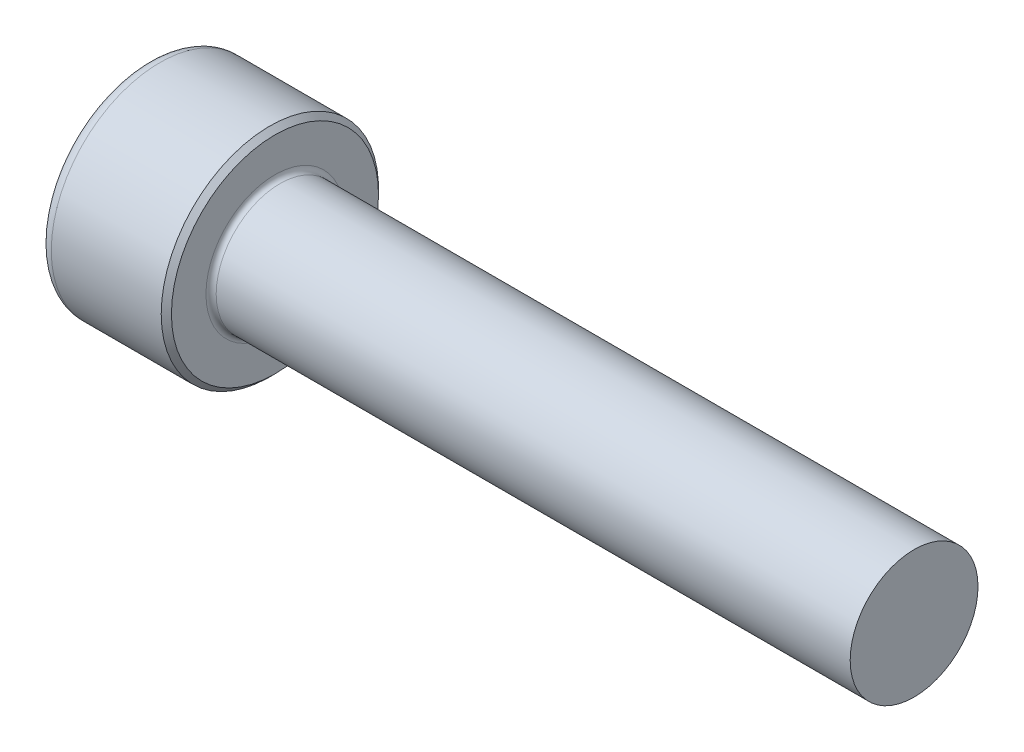
ISO-10303-21;
HEADER;
FILE_DESCRIPTION(('STEP AP214'),'2;1');
FILE_NAME('part.step','',(''),(''),'','','');
FILE_SCHEMA(('AUTOMOTIVE_DESIGN { 1 0 10303 214 1 1 1 1 }'));
ENDSEC;
DATA;
#1=APPLICATION_CONTEXT('core data for automotive mechanical design processes');
#2=APPLICATION_PROTOCOL_DEFINITION('international standard','automotive_design',2000,#1);
#3=PRODUCT_CONTEXT('',#1,'mechanical');
#4=PRODUCT('Part','Part','',(#3));
#5=PRODUCT_RELATED_PRODUCT_CATEGORY('part','',(#4));
#6=PRODUCT_DEFINITION_FORMATION('','',#4);
#7=PRODUCT_DEFINITION_CONTEXT('part definition',#1,'design');
#8=PRODUCT_DEFINITION('design','',#6,#7);
#9=PRODUCT_DEFINITION_SHAPE('','',#8);
#10=(LENGTH_UNIT() NAMED_UNIT(*) SI_UNIT(.MILLI.,.METRE.));
#11=(NAMED_UNIT(*) PLANE_ANGLE_UNIT() SI_UNIT($,.RADIAN.));
#12=(NAMED_UNIT(*) SI_UNIT($,.STERADIAN.) SOLID_ANGLE_UNIT());
#13=UNCERTAINTY_MEASURE_WITH_UNIT(LENGTH_MEASURE(1.E-05),#10,'distance_accuracy_value','');
#14=(GEOMETRIC_REPRESENTATION_CONTEXT(3) GLOBAL_UNCERTAINTY_ASSIGNED_CONTEXT((#13)) GLOBAL_UNIT_ASSIGNED_CONTEXT((#10,
#11,#12)) REPRESENTATION_CONTEXT('',''));
#15=CARTESIAN_POINT('',(0.,0.,0.));
#16=DIRECTION('',(0.,0.,1.));
#17=DIRECTION('',(1.,0.,0.));
#18=AXIS2_PLACEMENT_3D('',#15,#16,#17);
#19=CARTESIAN_POINT('',(0.,0.,0.));
#20=DIRECTION('',(-1.,0.,0.));
#21=DIRECTION('',(0.,0.,1.));
#22=AXIS2_PLACEMENT_3D('',#19,#20,#21);
#23=CYLINDRICAL_SURFACE('',#22,2.5);
#24=CARTESIAN_POINT('',(5.2,0.,0.));
#25=DIRECTION('',(-1.,0.,0.));
#26=DIRECTION('',(0.,0.,1.));
#27=AXIS2_PLACEMENT_3D('',#24,#25,#26);
#28=CIRCLE('',#27,2.5);
#29=CARTESIAN_POINT('',(5.2,0.,2.5));
#30=VERTEX_POINT('',#29);
#31=EDGE_CURVE('E202',#30,#30,#28,.T.);
#32=ORIENTED_EDGE('',*,*,#31,.F.);
#33=EDGE_LOOP('',(#32));
#34=FACE_BOUND('',#33,.T.);
#35=CARTESIAN_POINT('',(30.,0.,0.));
#36=DIRECTION('',(1.,0.,0.));
#37=DIRECTION('',(0.,0.,-1.));
#38=AXIS2_PLACEMENT_3D('',#35,#36,#37);
#39=CIRCLE('',#38,2.5);
#40=CARTESIAN_POINT('',(30.,0.,-2.5));
#41=VERTEX_POINT('',#40);
#42=EDGE_CURVE('E49',#41,#41,#39,.T.);
#43=ORIENTED_EDGE('',*,*,#42,.F.);
#44=EDGE_LOOP('',(#43));
#45=FACE_BOUND('',#44,.T.);
#46=ADVANCED_FACE('F45',(#34,#45),#23,.T.);
#47=CARTESIAN_POINT('',(0.,0.,0.));
#48=DIRECTION('',(1.,0.,0.));
#49=DIRECTION('',(0.,0.,-1.));
#50=AXIS2_PLACEMENT_3D('',#47,#48,#49);
#51=PLANE('',#50);
#52=CARTESIAN_POINT('',(0.,0.,0.));
#53=DIRECTION('',(1.,0.,0.));
#54=DIRECTION('',(0.,0.,-1.));
#55=AXIS2_PLACEMENT_3D('',#52,#53,#54);
#56=CIRCLE('',#55,3.75);
#57=CARTESIAN_POINT('',(0.,0.,-3.75));
#58=VERTEX_POINT('',#57);
#59=EDGE_CURVE('E194',#58,#58,#56,.F.);
#60=ORIENTED_EDGE('',*,*,#59,.T.);
#61=EDGE_LOOP('',(#60));
#62=FACE_BOUND('',#61,.T.);
#63=CARTESIAN_POINT('',(0.,0.,0.));
#64=DIRECTION('',(-1.,0.,0.));
#65=DIRECTION('',(0.,0.,1.));
#66=AXIS2_PLACEMENT_3D('',#63,#64,#65);
#67=CIRCLE('',#66,2.29);
#68=CARTESIAN_POINT('',(0.,0.,-2.29));
#69=VERTEX_POINT('',#68);
#70=CARTESIAN_POINT('',(0.,-1.98319817466637,-1.145));
#71=VERTEX_POINT('',#70);
#72=EDGE_CURVE('E68',#69,#71,#67,.T.);
#73=ORIENTED_EDGE('',*,*,#72,.F.);
#74=CARTESIAN_POINT('',(0.,1.98319817466637,-1.145));
#75=VERTEX_POINT('',#74);
#76=EDGE_CURVE('E147',#75,#69,#67,.T.);
#77=ORIENTED_EDGE('',*,*,#76,.F.);
#78=CARTESIAN_POINT('',(0.,1.98319817466637,1.145));
#79=VERTEX_POINT('',#78);
#80=EDGE_CURVE('E139',#79,#75,#67,.T.);
#81=ORIENTED_EDGE('',*,*,#80,.F.);
#82=CARTESIAN_POINT('',(0.,0.,2.29));
#83=VERTEX_POINT('',#82);
#84=EDGE_CURVE('E110',#83,#79,#67,.T.);
#85=ORIENTED_EDGE('',*,*,#84,.F.);
#86=CARTESIAN_POINT('',(0.,-1.98319817466637,1.145));
#87=VERTEX_POINT('',#86);
#88=EDGE_CURVE('E100',#87,#83,#67,.T.);
#89=ORIENTED_EDGE('',*,*,#88,.F.);
#90=EDGE_CURVE('E61',#71,#87,#67,.T.);
#91=ORIENTED_EDGE('',*,*,#90,.F.);
#92=EDGE_LOOP('',(#73,#77,#81,#85,#89,#91));
#93=FACE_BOUND('',#92,.T.);
#94=ADVANCED_FACE('F137',(#62,#93),#51,.F.);
#95=CARTESIAN_POINT('',(0.,0.,0.));
#96=DIRECTION('',(-1.,0.,0.));
#97=DIRECTION('',(0.,0.,1.));
#98=AXIS2_PLACEMENT_3D('',#95,#96,#97);
#99=CYLINDRICAL_SURFACE('',#98,4.25);
#100=CARTESIAN_POINT('',(4.8,0.,0.));
#101=DIRECTION('',(-1.,0.,0.));
#102=DIRECTION('',(0.,0.,1.));
#103=AXIS2_PLACEMENT_3D('',#100,#101,#102);
#104=CIRCLE('',#103,4.25);
#105=CARTESIAN_POINT('',(4.8,0.,4.25));
#106=VERTEX_POINT('',#105);
#107=EDGE_CURVE('E186',#106,#106,#104,.T.);
#108=ORIENTED_EDGE('',*,*,#107,.T.);
#109=EDGE_LOOP('',(#108));
#110=FACE_BOUND('',#109,.T.);
#111=CARTESIAN_POINT('',(0.5,0.,0.));
#112=DIRECTION('',(1.,0.,0.));
#113=DIRECTION('',(0.,0.,-1.));
#114=AXIS2_PLACEMENT_3D('',#111,#112,#113);
#115=CIRCLE('',#114,4.25);
#116=CARTESIAN_POINT('',(0.5,0.,-4.25));
#117=VERTEX_POINT('',#116);
#118=EDGE_CURVE('E190',#117,#117,#115,.T.);
#119=ORIENTED_EDGE('',*,*,#118,.T.);
#120=EDGE_LOOP('',(#119));
#121=FACE_BOUND('',#120,.T.);
#122=ADVANCED_FACE('F274',(#110,#121),#99,.T.);
#123=CARTESIAN_POINT('',(5.,4.25,0.));
#124=DIRECTION('',(-1.,0.,0.));
#125=DIRECTION('',(0.,0.,1.));
#126=AXIS2_PLACEMENT_3D('',#123,#124,#125);
#127=PLANE('',#126);
#128=CARTESIAN_POINT('',(5.,0.,0.));
#129=DIRECTION('',(-1.,0.,0.));
#130=DIRECTION('',(0.,0.,1.));
#131=AXIS2_PLACEMENT_3D('',#128,#129,#130);
#132=CIRCLE('',#131,4.05);
#133=CARTESIAN_POINT('',(5.,0.,4.05));
#134=VERTEX_POINT('',#133);
#135=EDGE_CURVE('E55',#134,#134,#132,.F.);
#136=ORIENTED_EDGE('',*,*,#135,.T.);
#137=EDGE_LOOP('',(#136));
#138=FACE_BOUND('',#137,.T.);
#139=CARTESIAN_POINT('',(5.,0.,0.));
#140=DIRECTION('',(-1.,0.,0.));
#141=DIRECTION('',(0.,0.,1.));
#142=AXIS2_PLACEMENT_3D('',#139,#140,#141);
#143=CIRCLE('',#142,2.7);
#144=CARTESIAN_POINT('',(5.,0.,2.7));
#145=VERTEX_POINT('',#144);
#146=EDGE_CURVE('E198',#145,#145,#143,.T.);
#147=ORIENTED_EDGE('',*,*,#146,.T.);
#148=EDGE_LOOP('',(#147));
#149=FACE_BOUND('',#148,.T.);
#150=ADVANCED_FACE('F284',(#138,#149),#127,.F.);
#151=CARTESIAN_POINT('',(5.2,0.,0.));
#152=DIRECTION('',(-1.,0.,0.));
#153=DIRECTION('',(0.,0.,1.));
#154=AXIS2_PLACEMENT_3D('',#151,#152,#153);
#155=TOROIDAL_SURFACE('',#154,2.7,0.2);
#156=ORIENTED_EDGE('',*,*,#146,.F.);
#157=EDGE_LOOP('',(#156));
#158=FACE_BOUND('',#157,.T.);
#159=ORIENTED_EDGE('',*,*,#31,.T.);
#160=EDGE_LOOP('',(#159));
#161=FACE_BOUND('',#160,.T.);
#162=ADVANCED_FACE('F280',(#158,#161),#155,.F.);
#163=CARTESIAN_POINT('',(0.5,0.,0.));
#164=DIRECTION('',(1.,0.,0.));
#165=DIRECTION('',(0.,0.,-1.));
#166=AXIS2_PLACEMENT_3D('',#163,#164,#165);
#167=TOROIDAL_SURFACE('',#166,3.75,0.5);
#168=ORIENTED_EDGE('',*,*,#118,.F.);
#169=EDGE_LOOP('',(#168));
#170=FACE_BOUND('',#169,.T.);
#171=ORIENTED_EDGE('',*,*,#59,.F.);
#172=EDGE_LOOP('',(#171));
#173=FACE_BOUND('',#172,.T.);
#174=ADVANCED_FACE('F283',(#170,#173),#167,.T.);
#175=CARTESIAN_POINT('',(4.8,0.,0.));
#176=DIRECTION('',(-1.,0.,0.));
#177=DIRECTION('',(0.,0.,1.));
#178=AXIS2_PLACEMENT_3D('',#175,#176,#177);
#179=CONICAL_SURFACE('',#178,4.25,0.785398163397453);
#180=ORIENTED_EDGE('',*,*,#135,.F.);
#181=EDGE_LOOP('',(#180));
#182=FACE_BOUND('',#181,.T.);
#183=ORIENTED_EDGE('',*,*,#107,.F.);
#184=EDGE_LOOP('',(#183));
#185=FACE_BOUND('',#184,.T.);
#186=ADVANCED_FACE('F47',(#182,#185),#179,.T.);
#187=CARTESIAN_POINT('',(0.,0.,0.));
#188=DIRECTION('',(-1.,0.,0.));
#189=DIRECTION('',(0.,0.,1.));
#190=AXIS2_PLACEMENT_3D('',#187,#188,#189);
#191=CONICAL_SURFACE('',#190,2.29,1.0471975511966);
#192=ORIENTED_EDGE('',*,*,#84,.T.);
#193=CARTESIAN_POINT('',(-6.66717087727477E-05,-0.000199999999999763,2.29011547005384));
#194=CARTESIAN_POINT('',(0.0289970746443421,0.086952924434542,2.23979770567089));
#195=CARTESIAN_POINT('',(0.0554298671491021,0.174858144215212,2.18904560336735));
#196=CARTESIAN_POINT('',(0.101569432018717,0.352190878966828,2.08666250122237));
#197=CARTESIAN_POINT('',(0.121259880415737,0.44162154580974,2.03502968164681));
#198=CARTESIAN_POINT('',(0.151912109098693,0.619374508700817,1.93240396067239));
#199=CARTESIAN_POINT('',(0.163077876213052,0.707669449094417,1.88142685306806));
#200=CARTESIAN_POINT('',(0.17640951895551,0.884674966706633,1.7792326698266));
#201=CARTESIAN_POINT('',(0.178586432176738,0.97338490019511,1.72801596584724));
#202=CARTESIAN_POINT('',(0.174067162231532,1.13915625525884,1.63230782937726));
#203=CARTESIAN_POINT('',(0.168480615987234,1.21624244292292,1.5878020981786));
#204=CARTESIAN_POINT('',(0.150771602252674,1.36991258205614,1.49908060198363));
#205=CARTESIAN_POINT('',(0.138643080409066,1.44649600167483,1.45486514405132));
#206=CARTESIAN_POINT('',(0.108321556973433,1.60048319626379,1.36596059580363));
#207=CARTESIAN_POINT('',(0.0899999732190711,1.67786747328963,1.32128276263171));
#208=CARTESIAN_POINT('',(0.0484167389071468,1.83148159838581,1.2325936061561));
#209=CARTESIAN_POINT('',(0.0251648643389043,1.90771341577406,1.18858114586619));
#210=CARTESIAN_POINT('',(-6.667170877254E-05,1.98339817466637,1.14488452994616));
#211=B_SPLINE_CURVE_WITH_KNOTS('',3,(#193,#194,#195,#196,#197,#198,#199,#200,#201,#202,#203,
#204,#205,#206,#207,#208,#209,#210),.UNSPECIFIED.,.F.,.F.,(4,2,2,2,2,2,2,2,4),(0.,
0.314368600877967,0.629493028947399,0.936817561586036,1.24376461187035,1.5110699369469,
1.7786230686029,2.05211240025128,2.32506443371539),.UNSPECIFIED.);
#212=EDGE_CURVE('E11',#83,#79,#211,.T.);
#213=ORIENTED_EDGE('',*,*,#212,.F.);
#214=EDGE_LOOP('',(#192,#213));
#215=FACE_BOUND('',#214,.T.);
#216=ADVANCED_FACE('F113',(#215),#191,.F.);
#217=ORIENTED_EDGE('',*,*,#80,.T.);
#218=CARTESIAN_POINT('',(-0.737423065904649,1.98319817466636,-2.9651690756887));
#219=CARTESIAN_POINT('',(-0.696335597798475,1.98319817466636,-2.87952774841077));
#220=CARTESIAN_POINT('',(-0.65567489694743,1.98319817466636,-2.79367778718436));
#221=CARTESIAN_POINT('',(-0.575449127727106,1.98319817466636,-2.62144940035753));
#222=CARTESIAN_POINT('',(-0.535884256534338,1.98319817466636,-2.53507088302234));
#223=CARTESIAN_POINT('',(-0.457871214679984,1.98319817466636,-2.36117891825076));
#224=CARTESIAN_POINT('',(-0.419431273823567,1.98319817466636,-2.27366176473997));
#225=CARTESIAN_POINT('',(-0.344275135005474,1.98319817466636,-2.09789307129859));
#226=CARTESIAN_POINT('',(-0.307558847416684,1.98319817466636,-2.00964156983442));
#227=CARTESIAN_POINT('',(-0.23537405891633,1.98319817466636,-1.82993909718885));
#228=CARTESIAN_POINT('',(-0.199963281311202,1.98319817466636,-1.73846480209699));
#229=CARTESIAN_POINT('',(-0.132085804136675,1.98319817466636,-1.55440976387771));
#230=CARTESIAN_POINT('',(-0.0996194460365617,1.98319817466636,-1.46182889382445));
#231=CARTESIAN_POINT('',(-0.0385592553831905,1.98319817466636,-1.27562724000914));
#232=CARTESIAN_POINT('',(-0.00995646709253792,1.98319817466636,-1.18200942505016));
#233=CARTESIAN_POINT('',(0.04239847198178,1.98319817466636,-0.993432151978476));
#234=CARTESIAN_POINT('',(0.0661518274561018,1.98319817466636,-0.898473033353332));
#235=CARTESIAN_POINT('',(0.107541445767531,1.98319817466636,-0.707410736519421));
#236=CARTESIAN_POINT('',(0.12519027230812,1.98319817466636,-0.611310334196718));
#237=CARTESIAN_POINT('',(0.153215985445547,1.98319817466636,-0.418035031067098));
#238=CARTESIAN_POINT('',(0.163593363460354,1.98319817466636,-0.320860203322791));
#239=CARTESIAN_POINT('',(0.176110295556352,1.98319817466636,-0.12713531096718));
#240=CARTESIAN_POINT('',(0.178347061886284,1.98319817466637,-0.0305917109258025));
#241=CARTESIAN_POINT('',(0.174654313491269,1.98319817466637,0.162335586315468));
#242=CARTESIAN_POINT('',(0.168724293109126,1.98319817466637,0.258719273244178));
#243=CARTESIAN_POINT('',(0.144538657394588,1.98319817466637,0.496531836309324));
#244=CARTESIAN_POINT('',(0.121750533293761,1.98319817466637,0.637499920804447));
#245=CARTESIAN_POINT('',(0.0629865996332653,1.98319817466637,0.916694739102691));
#246=CARTESIAN_POINT('',(0.0269948957486464,1.98319817466637,1.05491795638262));
#247=CARTESIAN_POINT('',(-0.0344877429393334,1.98319817466637,1.26164599106909));
#248=CARTESIAN_POINT('',(-0.0565178888246669,1.98319817466637,1.33121940303916));
#249=CARTESIAN_POINT('',(-0.102616094096623,1.98319817466637,1.46964201153911));
#250=CARTESIAN_POINT('',(-0.126682881667825,1.98319817466637,1.53849163028932));
#251=CARTESIAN_POINT('',(-0.176504851106972,1.98319817466637,1.67555866191056));
#252=CARTESIAN_POINT('',(-0.202259726135116,1.98319817466637,1.74377618711701));
#253=CARTESIAN_POINT('',(-0.255179289864796,1.98319817466637,1.87967370656846));
#254=CARTESIAN_POINT('',(-0.282344216759939,1.98319817466637,1.947353607754));
#255=CARTESIAN_POINT('',(-0.353423903033721,1.98319817466637,2.12010925018289));
#256=CARTESIAN_POINT('',(-0.398177319478556,1.98319817466637,2.22483955976595));
#257=CARTESIAN_POINT('',(-0.489841525450775,1.98319817466637,2.43335442741098));
#258=CARTESIAN_POINT('',(-0.536752476595294,1.98319817466637,2.53713891392301));
#259=CARTESIAN_POINT('',(-0.67996107526549,1.98319817466637,2.84738878513368));
#260=CARTESIAN_POINT('',(-0.778719786371109,1.98319817466637,3.05271592662016));
#261=CARTESIAN_POINT('',(-0.980379133367604,1.98319817466637,3.46161603190118));
#262=CARTESIAN_POINT('',(-1.08328471183425,1.98319817466637,3.66518652891241));
#263=CARTESIAN_POINT('',(-1.29174190336883,1.98319817466637,4.07093277316329));
#264=CARTESIAN_POINT('',(-1.39729318010141,1.98319817466637,4.27310869356374));
#265=CARTESIAN_POINT('',(-1.60016980433773,1.98319817466637,4.65745813317928));
#266=CARTESIAN_POINT('',(-1.69733123970717,1.98319817466637,4.83971847371059));
#267=CARTESIAN_POINT('',(-1.89276116585672,1.98319817466637,5.20365287690224));
#268=CARTESIAN_POINT('',(-1.99102969760591,1.98319817466637,5.38532691754387));
#269=CARTESIAN_POINT('',(-2.18814518361219,1.98319817466637,5.74776178237518));
#270=CARTESIAN_POINT('',(-2.2869900308882,1.98319817466637,5.92852375401001));
#271=CARTESIAN_POINT('',(-2.48532306225631,1.98319817466637,6.2896822398489));
#272=CARTESIAN_POINT('',(-2.58481121241045,1.98319817466637,6.47007877268312));
#273=CARTESIAN_POINT('',(-2.68453526318773,1.98319817466637,6.65034401162986));
#274=B_SPLINE_CURVE_WITH_KNOTS('',3,(#218,#219,#220,#221,#222,#223,#224,#225,#226,#227,#228,
#229,#230,#231,#232,#233,#234,#235,#236,#237,#238,#239,#240,#241,#242,#243,#244,#245,#246,#247,
#248,#249,#250,#251,#252,#253,#254,#255,#256,#257,#258,#259,#260,#261,#262,#263,#264,#265,#266,
#267,#268,#269,#270,#271,#272,#273),.UNSPECIFIED.,.F.,.F.,(4,2,2,2,2,2,2,2,2,2,2,2,2,2,2,2,2,2,
2,2,2,2,2,2,2,2,2,4),(0.,0.284966421400571,0.569983789027809,0.856730082121155,1.14346144832977,
1.43768959624628,1.7319518227787,2.02551979602491,2.31901475246749,2.61190202306262,
2.90476949788358,3.19412796273653,3.48350434439975,3.91101968257654,4.33905135689423,
4.55796121431233,4.77673536450837,4.99546985831853,5.21424142296245,5.55588111803492,
5.89754644655145,6.58098995249444,7.26527364177401,7.94947077806411,8.56908938652166,
9.18873100032677,9.80679654089589,10.4248297367012),.UNSPECIFIED.);
#275=EDGE_CURVE('E141',#79,#75,#274,.F.);
#276=ORIENTED_EDGE('',*,*,#275,.F.);
#277=EDGE_LOOP('',(#217,#276));
#278=FACE_BOUND('',#277,.T.);
#279=ADVANCED_FACE('F304',(#278),#191,.F.);
#280=ORIENTED_EDGE('',*,*,#76,.T.);
#281=CARTESIAN_POINT('',(-6.66717087728214E-05,1.98339817466637,-1.14488452994616));
#282=CARTESIAN_POINT('',(0.0289970746443418,1.89624525023182,-1.19520229432911));
#283=CARTESIAN_POINT('',(0.0554298671491018,1.80834003045115,-1.24595439663265));
#284=CARTESIAN_POINT('',(0.101569432018717,1.63100729569954,-1.34833749877763));
#285=CARTESIAN_POINT('',(0.121259880415736,1.54157662885663,-1.39997031835319));
#286=CARTESIAN_POINT('',(0.151912109098692,1.36382366596555,-1.50259603932761));
#287=CARTESIAN_POINT('',(0.163077876213052,1.27552872557195,-1.55357314693194));
#288=CARTESIAN_POINT('',(0.17640951895551,1.09852320795973,-1.6557673301734));
#289=CARTESIAN_POINT('',(0.178586432176738,1.00981327447126,-1.70698403415276));
#290=CARTESIAN_POINT('',(0.174067162231532,0.844041919407522,-1.80269217062274));
#291=CARTESIAN_POINT('',(0.168480615987233,0.766955731743443,-1.8471979018214));
#292=CARTESIAN_POINT('',(0.150771602252674,0.613285592610222,-1.93591939801637));
#293=CARTESIAN_POINT('',(0.138643080409066,0.53670217299153,-1.98013485594868));
#294=CARTESIAN_POINT('',(0.108321556973432,0.382714978402575,-2.06903940419637));
#295=CARTESIAN_POINT('',(0.089999973219071,0.305330701376735,-2.11371723736828));
#296=CARTESIAN_POINT('',(0.0484167389071468,0.151716576280552,-2.20240639384389));
#297=CARTESIAN_POINT('',(0.0251648643389043,0.0754847588923067,-2.24641885413381));
#298=CARTESIAN_POINT('',(-6.66717087722914E-05,-0.000200000000000301,-2.29011547005384));
#299=B_SPLINE_CURVE_WITH_KNOTS('',3,(#281,#282,#283,#284,#285,#286,#287,#288,#289,#290,#291,
#292,#293,#294,#295,#296,#297,#298),.UNSPECIFIED.,.F.,.F.,(4,2,2,2,2,2,2,2,4),(0.,
0.314368600877967,0.629493028947399,0.936817561586036,1.24376461187035,1.5110699369469,
1.7786230686029,2.05211240025128,2.32506443371539),.UNSPECIFIED.);
#300=EDGE_CURVE('E145',#75,#69,#299,.T.);
#301=ORIENTED_EDGE('',*,*,#300,.F.);
#302=EDGE_LOOP('',(#280,#301));
#303=FACE_BOUND('',#302,.T.);
#304=ADVANCED_FACE('F314',(#303),#191,.F.);
#305=ORIENTED_EDGE('',*,*,#72,.T.);
#306=CARTESIAN_POINT('',(-6.66717087727477E-05,0.000199999999999763,-2.29011547005384));
#307=CARTESIAN_POINT('',(0.028997074644342,-0.086952924434542,-2.23979770567089));
#308=CARTESIAN_POINT('',(0.055429867149102,-0.174858144215212,-2.18904560336735));
#309=CARTESIAN_POINT('',(0.101569432018717,-0.352190878966828,-2.08666250122237));
#310=CARTESIAN_POINT('',(0.121259880415737,-0.44162154580974,-2.03502968164681));
#311=CARTESIAN_POINT('',(0.151912109098693,-0.619374508700817,-1.93240396067239));
#312=CARTESIAN_POINT('',(0.163077876213052,-0.707669449094417,-1.88142685306806));
#313=CARTESIAN_POINT('',(0.17640951895551,-0.884674966706633,-1.7792326698266));
#314=CARTESIAN_POINT('',(0.178586432176738,-0.97338490019511,-1.72801596584724));
#315=CARTESIAN_POINT('',(0.174067162231532,-1.13915625525884,-1.63230782937726));
#316=CARTESIAN_POINT('',(0.168480615987233,-1.21624244292292,-1.5878020981786));
#317=CARTESIAN_POINT('',(0.150771602252674,-1.36991258205614,-1.49908060198363));
#318=CARTESIAN_POINT('',(0.138643080409066,-1.44649600167483,-1.45486514405132));
#319=CARTESIAN_POINT('',(0.108321556973432,-1.60048319626379,-1.36596059580363));
#320=CARTESIAN_POINT('',(0.089999973219071,-1.67786747328963,-1.32128276263171));
#321=CARTESIAN_POINT('',(0.0484167389071469,-1.83148159838581,-1.2325936061561));
#322=CARTESIAN_POINT('',(0.0251648643389044,-1.90771341577406,-1.18858114586619));
#323=CARTESIAN_POINT('',(-6.667170877254E-05,-1.98339817466637,-1.14488452994616));
#324=B_SPLINE_CURVE_WITH_KNOTS('',3,(#306,#307,#308,#309,#310,#311,#312,#313,#314,#315,#316,
#317,#318,#319,#320,#321,#322,#323),.UNSPECIFIED.,.F.,.F.,(4,2,2,2,2,2,2,2,4),(0.,
0.314368600877967,0.6294930289474,0.936817561586036,1.24376461187035,1.5110699369469,
1.7786230686029,2.05211240025128,2.32506443371539),.UNSPECIFIED.);
#325=EDGE_CURVE('E250',#69,#71,#324,.T.);
#326=ORIENTED_EDGE('',*,*,#325,.F.);
#327=EDGE_LOOP('',(#305,#326));
#328=FACE_BOUND('',#327,.T.);
#329=ADVANCED_FACE('F323',(#328),#191,.F.);
#330=ORIENTED_EDGE('',*,*,#90,.T.);
#331=CARTESIAN_POINT('',(-0.737423065904648,-1.98319817466636,-2.9651690756887));
#332=CARTESIAN_POINT('',(-0.696335597798474,-1.98319817466636,-2.87952774841077));
#333=CARTESIAN_POINT('',(-0.655674896947429,-1.98319817466636,-2.79367778718436));
#334=CARTESIAN_POINT('',(-0.575449127727106,-1.98319817466636,-2.62144940035753));
#335=CARTESIAN_POINT('',(-0.535884256534338,-1.98319817466636,-2.53507088302234));
#336=CARTESIAN_POINT('',(-0.457871214679984,-1.98319817466636,-2.36117891825076));
#337=CARTESIAN_POINT('',(-0.419431273823567,-1.98319817466636,-2.27366176473997));
#338=CARTESIAN_POINT('',(-0.344275135005473,-1.98319817466636,-2.09789307129859));
#339=CARTESIAN_POINT('',(-0.307558847416684,-1.98319817466636,-2.00964156983442));
#340=CARTESIAN_POINT('',(-0.23537405891633,-1.98319817466636,-1.82993909718885));
#341=CARTESIAN_POINT('',(-0.199963281311201,-1.98319817466636,-1.73846480209699));
#342=CARTESIAN_POINT('',(-0.132085804136675,-1.98319817466636,-1.55440976387771));
#343=CARTESIAN_POINT('',(-0.0996194460365612,-1.98319817466636,-1.46182889382444));
#344=CARTESIAN_POINT('',(-0.0385592553831901,-1.98319817466636,-1.27562724000913));
#345=CARTESIAN_POINT('',(-0.00995646709253759,-1.98319817466636,-1.18200942505016));
#346=CARTESIAN_POINT('',(0.0423984719817802,-1.98319817466636,-0.993432151978475));
#347=CARTESIAN_POINT('',(0.066151827456102,-1.98319817466636,-0.898473033353331));
#348=CARTESIAN_POINT('',(0.107541445767531,-1.98319817466636,-0.70741073651942));
#349=CARTESIAN_POINT('',(0.12519027230812,-1.98319817466636,-0.611310334196718));
#350=CARTESIAN_POINT('',(0.153215985445547,-1.98319817466636,-0.418035031067098));
#351=CARTESIAN_POINT('',(0.163593363460354,-1.98319817466636,-0.32086020332279));
#352=CARTESIAN_POINT('',(0.176110295556352,-1.98319817466636,-0.12713531096718));
#353=CARTESIAN_POINT('',(0.178347061886284,-1.98319817466637,-0.0305917109258023));
#354=CARTESIAN_POINT('',(0.174654313491269,-1.98319817466637,0.162335586315468));
#355=CARTESIAN_POINT('',(0.168724293109126,-1.98319817466637,0.258719273244179));
#356=CARTESIAN_POINT('',(0.144538657394588,-1.98319817466637,0.496531836309325));
#357=CARTESIAN_POINT('',(0.121750533293761,-1.98319817466637,0.637499920804447));
#358=CARTESIAN_POINT('',(0.0629865996332653,-1.98319817466637,0.916694739102692));
#359=CARTESIAN_POINT('',(0.0269948957486466,-1.98319817466637,1.05491795638262));
#360=CARTESIAN_POINT('',(-0.0344877429393334,-1.98319817466637,1.26164599106909));
#361=CARTESIAN_POINT('',(-0.056517888824667,-1.98319817466637,1.33121940303916));
#362=CARTESIAN_POINT('',(-0.102616094096623,-1.98319817466637,1.46964201153911));
#363=CARTESIAN_POINT('',(-0.126682881667825,-1.98319817466637,1.53849163028932));
#364=CARTESIAN_POINT('',(-0.176504851106972,-1.98319817466637,1.67555866191056));
#365=CARTESIAN_POINT('',(-0.202259726135116,-1.98319817466637,1.74377618711701));
#366=CARTESIAN_POINT('',(-0.255179289864796,-1.98319817466637,1.87967370656846));
#367=CARTESIAN_POINT('',(-0.282344216759939,-1.98319817466637,1.947353607754));
#368=CARTESIAN_POINT('',(-0.353423903033721,-1.98319817466637,2.12010925018289));
#369=CARTESIAN_POINT('',(-0.398177319478556,-1.98319817466637,2.22483955976595));
#370=CARTESIAN_POINT('',(-0.489841525450775,-1.98319817466637,2.43335442741098));
#371=CARTESIAN_POINT('',(-0.536752476595294,-1.98319817466637,2.53713891392301));
#372=CARTESIAN_POINT('',(-0.679961075265491,-1.98319817466637,2.84738878513368));
#373=CARTESIAN_POINT('',(-0.77871978637111,-1.98319817466637,3.05271592662016));
#374=CARTESIAN_POINT('',(-0.980379133367606,-1.98319817466637,3.46161603190118));
#375=CARTESIAN_POINT('',(-1.08328471183425,-1.98319817466637,3.66518652891241));
#376=CARTESIAN_POINT('',(-1.29174190336883,-1.98319817466637,4.07093277316329));
#377=CARTESIAN_POINT('',(-1.39729318010141,-1.98319817466637,4.27310869356374));
#378=CARTESIAN_POINT('',(-1.60016980433774,-1.98319817466637,4.65745813317928));
#379=CARTESIAN_POINT('',(-1.69733123970717,-1.98319817466637,4.83971847371059));
#380=CARTESIAN_POINT('',(-1.89276116585672,-1.98319817466637,5.20365287690224));
#381=CARTESIAN_POINT('',(-1.99102969760592,-1.98319817466637,5.38532691754387));
#382=CARTESIAN_POINT('',(-2.18814518361219,-1.98319817466637,5.74776178237518));
#383=CARTESIAN_POINT('',(-2.2869900308882,-1.98319817466637,5.92852375401001));
#384=CARTESIAN_POINT('',(-2.48532306225631,-1.98319817466637,6.2896822398489));
#385=CARTESIAN_POINT('',(-2.58481121241045,-1.98319817466637,6.47007877268312));
#386=CARTESIAN_POINT('',(-2.68453526318773,-1.98319817466637,6.65034401162987));
#387=B_SPLINE_CURVE_WITH_KNOTS('',3,(#331,#332,#333,#334,#335,#336,#337,#338,#339,#340,#341,
#342,#343,#344,#345,#346,#347,#348,#349,#350,#351,#352,#353,#354,#355,#356,#357,#358,#359,#360,
#361,#362,#363,#364,#365,#366,#367,#368,#369,#370,#371,#372,#373,#374,#375,#376,#377,#378,#379,
#380,#381,#382,#383,#384,#385,#386),.UNSPECIFIED.,.F.,.F.,(4,2,2,2,2,2,2,2,2,2,2,2,2,2,2,2,2,2,
2,2,2,2,2,2,2,2,2,4),(0.,0.284966421400572,0.569983789027809,0.856730082121154,1.14346144832977,
1.43768959624628,1.7319518227787,2.0255197960249,2.31901475246749,2.61190202306262,
2.90476949788358,3.19412796273653,3.48350434439975,3.91101968257654,4.33905135689423,
4.55796121431233,4.77673536450837,4.99546985831853,5.21424142296245,5.55588111803492,
5.89754644655145,6.58098995249444,7.26527364177401,7.94947077806411,8.56908938652166,
9.18873100032678,9.8067965408959,10.4248297367012),.UNSPECIFIED.);
#388=EDGE_CURVE('E126',#71,#87,#387,.T.);
#389=ORIENTED_EDGE('',*,*,#388,.F.);
#390=EDGE_LOOP('',(#330,#389));
#391=FACE_BOUND('',#390,.T.);
#392=ADVANCED_FACE('F317',(#391),#191,.F.);
#393=ORIENTED_EDGE('',*,*,#88,.T.);
#394=CARTESIAN_POINT('',(-6.66717087730718E-05,-1.98339817466637,1.14488452994616));
#395=CARTESIAN_POINT('',(0.0289970746443415,-1.89624525023182,1.19520229432911));
#396=CARTESIAN_POINT('',(0.0554298671491014,-1.80834003045115,1.24595439663265));
#397=CARTESIAN_POINT('',(0.101569432018716,-1.63100729569954,1.34833749877763));
#398=CARTESIAN_POINT('',(0.121259880415736,-1.54157662885663,1.39997031835319));
#399=CARTESIAN_POINT('',(0.151912109098692,-1.36382366596555,1.50259603932761));
#400=CARTESIAN_POINT('',(0.163077876213052,-1.27552872557195,1.55357314693194));
#401=CARTESIAN_POINT('',(0.17640951895551,-1.09852320795973,1.6557673301734));
#402=CARTESIAN_POINT('',(0.178586432176738,-1.00981327447126,1.70698403415276));
#403=CARTESIAN_POINT('',(0.174067162231532,-0.844041919407523,1.80269217062274));
#404=CARTESIAN_POINT('',(0.168480615987233,-0.766955731743443,1.8471979018214));
#405=CARTESIAN_POINT('',(0.150771602252674,-0.613285592610222,1.93591939801637));
#406=CARTESIAN_POINT('',(0.138643080409066,-0.53670217299153,1.98013485594868));
#407=CARTESIAN_POINT('',(0.108321556973433,-0.382714978402575,2.06903940419637));
#408=CARTESIAN_POINT('',(0.089999973219071,-0.305330701376735,2.11371723736828));
#409=CARTESIAN_POINT('',(0.0484167389071468,-0.151716576280552,2.20240639384389));
#410=CARTESIAN_POINT('',(0.0251648643389043,-0.0754847588923072,2.24641885413381));
#411=CARTESIAN_POINT('',(-6.66717087722914E-05,0.000200000000000107,2.29011547005384));
#412=B_SPLINE_CURVE_WITH_KNOTS('',3,(#394,#395,#396,#397,#398,#399,#400,#401,#402,#403,#404,
#405,#406,#407,#408,#409,#410,#411),.UNSPECIFIED.,.F.,.F.,(4,2,2,2,2,2,2,2,4),(0.,
0.314368600877967,0.629493028947399,0.936817561586036,1.24376461187035,1.5110699369469,
1.7786230686029,2.05211240025128,2.32506443371539),.UNSPECIFIED.);
#413=EDGE_CURVE('E104',#87,#83,#412,.T.);
#414=ORIENTED_EDGE('',*,*,#413,.F.);
#415=EDGE_LOOP('',(#393,#414));
#416=FACE_BOUND('',#415,.T.);
#417=ADVANCED_FACE('F102',(#416),#191,.F.);
#418=CARTESIAN_POINT('',(2.5,-1.98319817466637,1.145));
#419=DIRECTION('',(1.,0.,0.));
#420=DIRECTION('',(0.,0.,-1.));
#421=AXIS2_PLACEMENT_3D('',#418,#419,#420);
#422=PLANE('',#421);
#423=DIRECTION('',(0.,0.866025403784439,0.5));
#424=VECTOR('',#423,1.);
#425=CARTESIAN_POINT('',(2.5,-1.98319817466637,1.145));
#426=LINE('',#425,#424);
#427=CARTESIAN_POINT('',(2.5,-1.98319817466637,1.145));
#428=VERTEX_POINT('',#427);
#429=CARTESIAN_POINT('',(2.5,0.,2.29));
#430=VERTEX_POINT('',#429);
#431=EDGE_CURVE('E125',#428,#430,#426,.T.);
#432=ORIENTED_EDGE('',*,*,#431,.T.);
#433=DIRECTION('',(0.,0.866025403784439,-0.5));
#434=VECTOR('',#433,1.);
#435=CARTESIAN_POINT('',(2.5,0.,2.29));
#436=LINE('',#435,#434);
#437=CARTESIAN_POINT('',(2.5,1.98319817466637,1.145));
#438=VERTEX_POINT('',#437);
#439=EDGE_CURVE('E130',#430,#438,#436,.T.);
#440=ORIENTED_EDGE('',*,*,#439,.T.);
#441=DIRECTION('',(0.,0.,-1.));
#442=VECTOR('',#441,1.);
#443=CARTESIAN_POINT('',(2.5,1.98319817466637,1.145));
#444=LINE('',#443,#442);
#445=CARTESIAN_POINT('',(2.5,1.98319817466636,-1.145));
#446=VERTEX_POINT('',#445);
#447=EDGE_CURVE('E232',#438,#446,#444,.T.);
#448=ORIENTED_EDGE('',*,*,#447,.T.);
#449=DIRECTION('',(0.,-0.866025403784439,-0.5));
#450=VECTOR('',#449,1.);
#451=CARTESIAN_POINT('',(2.5,1.98319817466636,-1.145));
#452=LINE('',#451,#450);
#453=CARTESIAN_POINT('',(2.5,0.,-2.29));
#454=VERTEX_POINT('',#453);
#455=EDGE_CURVE('E228',#446,#454,#452,.T.);
#456=ORIENTED_EDGE('',*,*,#455,.T.);
#457=DIRECTION('',(0.,-0.866025403784438,0.5));
#458=VECTOR('',#457,1.);
#459=CARTESIAN_POINT('',(2.5,0.,-2.29));
#460=LINE('',#459,#458);
#461=CARTESIAN_POINT('',(2.5,-1.98319817466636,-1.145));
#462=VERTEX_POINT('',#461);
#463=EDGE_CURVE('E224',#454,#462,#460,.T.);
#464=ORIENTED_EDGE('',*,*,#463,.T.);
#465=DIRECTION('',(0.,0.,1.));
#466=VECTOR('',#465,1.);
#467=CARTESIAN_POINT('',(2.5,-1.98319817466636,-1.145));
#468=LINE('',#467,#466);
#469=EDGE_CURVE('E134',#462,#428,#468,.T.);
#470=ORIENTED_EDGE('',*,*,#469,.T.);
#471=EDGE_LOOP('',(#432,#440,#448,#456,#464,#470));
#472=FACE_BOUND('',#471,.T.);
#473=ADVANCED_FACE('F175',(#472),#422,.F.);
#474=CARTESIAN_POINT('',(2.5,0.,2.29));
#475=DIRECTION('',(0.,0.5,0.866025403784438));
#476=DIRECTION('',(0.,-0.866025403784438,0.5));
#477=AXIS2_PLACEMENT_3D('',#474,#475,#476);
#478=PLANE('',#477);
#479=DIRECTION('',(-1.,0.,0.));
#480=VECTOR('',#479,1.);
#481=CARTESIAN_POINT('',(2.5,0.,2.29));
#482=LINE('',#481,#480);
#483=EDGE_CURVE('E121',#430,#83,#482,.T.);
#484=ORIENTED_EDGE('',*,*,#483,.T.);
#485=ORIENTED_EDGE('',*,*,#212,.T.);
#486=DIRECTION('',(-1.,0.,0.));
#487=VECTOR('',#486,1.);
#488=CARTESIAN_POINT('',(2.5,1.98319817466637,1.145));
#489=LINE('',#488,#487);
#490=EDGE_CURVE('E133',#438,#79,#489,.T.);
#491=ORIENTED_EDGE('',*,*,#490,.F.);
#492=ORIENTED_EDGE('',*,*,#439,.F.);
#493=EDGE_LOOP('',(#484,#485,#491,#492));
#494=FACE_BOUND('',#493,.T.);
#495=ADVANCED_FACE('F128',(#494),#478,.F.);
#496=CARTESIAN_POINT('',(2.5,1.98319817466637,1.145));
#497=DIRECTION('',(0.,1.,0.));
#498=DIRECTION('',(0.,0.,1.));
#499=AXIS2_PLACEMENT_3D('',#496,#497,#498);
#500=PLANE('',#499);
#501=ORIENTED_EDGE('',*,*,#490,.T.);
#502=ORIENTED_EDGE('',*,*,#275,.T.);
#503=DIRECTION('',(-1.,0.,0.));
#504=VECTOR('',#503,1.);
#505=CARTESIAN_POINT('',(2.5,1.98319817466636,-1.145));
#506=LINE('',#505,#504);
#507=EDGE_CURVE('E208',#446,#75,#506,.T.);
#508=ORIENTED_EDGE('',*,*,#507,.F.);
#509=ORIENTED_EDGE('',*,*,#447,.F.);
#510=EDGE_LOOP('',(#501,#502,#508,#509));
#511=FACE_BOUND('',#510,.T.);
#512=ADVANCED_FACE('F164',(#511),#500,.F.);
#513=CARTESIAN_POINT('',(2.5,1.98319817466636,-1.145));
#514=DIRECTION('',(0.,0.5,-0.866025403784439));
#515=DIRECTION('',(0.,0.866025403784439,0.5));
#516=AXIS2_PLACEMENT_3D('',#513,#514,#515);
#517=PLANE('',#516);
#518=ORIENTED_EDGE('',*,*,#507,.T.);
#519=ORIENTED_EDGE('',*,*,#300,.T.);
#520=DIRECTION('',(-1.,0.,0.));
#521=VECTOR('',#520,1.);
#522=CARTESIAN_POINT('',(2.5,0.,-2.29));
#523=LINE('',#522,#521);
#524=EDGE_CURVE('E212',#454,#69,#523,.T.);
#525=ORIENTED_EDGE('',*,*,#524,.F.);
#526=ORIENTED_EDGE('',*,*,#455,.F.);
#527=EDGE_LOOP('',(#518,#519,#525,#526));
#528=FACE_BOUND('',#527,.T.);
#529=ADVANCED_FACE('F168',(#528),#517,.F.);
#530=CARTESIAN_POINT('',(2.5,0.,-2.29));
#531=DIRECTION('',(0.,-0.5,-0.866025403784439));
#532=DIRECTION('',(0.,0.866025403784439,-0.5));
#533=AXIS2_PLACEMENT_3D('',#530,#531,#532);
#534=PLANE('',#533);
#535=ORIENTED_EDGE('',*,*,#524,.T.);
#536=ORIENTED_EDGE('',*,*,#325,.T.);
#537=DIRECTION('',(-1.,0.,0.));
#538=VECTOR('',#537,1.);
#539=CARTESIAN_POINT('',(2.5,-1.98319817466636,-1.145));
#540=LINE('',#539,#538);
#541=EDGE_CURVE('E215',#462,#71,#540,.T.);
#542=ORIENTED_EDGE('',*,*,#541,.F.);
#543=ORIENTED_EDGE('',*,*,#463,.F.);
#544=EDGE_LOOP('',(#535,#536,#542,#543));
#545=FACE_BOUND('',#544,.T.);
#546=ADVANCED_FACE('F258',(#545),#534,.F.);
#547=CARTESIAN_POINT('',(2.5,-1.98319817466636,-1.145));
#548=DIRECTION('',(0.,-1.,0.));
#549=DIRECTION('',(0.,0.,-1.));
#550=AXIS2_PLACEMENT_3D('',#547,#548,#549);
#551=PLANE('',#550);
#552=ORIENTED_EDGE('',*,*,#541,.T.);
#553=ORIENTED_EDGE('',*,*,#388,.T.);
#554=DIRECTION('',(-1.,0.,0.));
#555=VECTOR('',#554,1.);
#556=CARTESIAN_POINT('',(2.5,-1.98319817466637,1.145));
#557=LINE('',#556,#555);
#558=EDGE_CURVE('E123',#428,#87,#557,.T.);
#559=ORIENTED_EDGE('',*,*,#558,.F.);
#560=ORIENTED_EDGE('',*,*,#469,.F.);
#561=EDGE_LOOP('',(#552,#553,#559,#560));
#562=FACE_BOUND('',#561,.T.);
#563=ADVANCED_FACE('F255',(#562),#551,.F.);
#564=CARTESIAN_POINT('',(2.5,-1.98319817466637,1.145));
#565=DIRECTION('',(0.,-0.5,0.866025403784439));
#566=DIRECTION('',(0.,-0.866025403784439,-0.5));
#567=AXIS2_PLACEMENT_3D('',#564,#565,#566);
#568=PLANE('',#567);
#569=ORIENTED_EDGE('',*,*,#558,.T.);
#570=ORIENTED_EDGE('',*,*,#413,.T.);
#571=ORIENTED_EDGE('',*,*,#483,.F.);
#572=ORIENTED_EDGE('',*,*,#431,.F.);
#573=EDGE_LOOP('',(#569,#570,#571,#572));
#574=FACE_BOUND('',#573,.T.);
#575=ADVANCED_FACE('F119',(#574),#568,.F.);
#576=CARTESIAN_POINT('',(30.,1.00798709580386,-0.0766530110877378));
#577=DIRECTION('',(1.,0.,0.));
#578=DIRECTION('',(0.,0.,-1.));
#579=AXIS2_PLACEMENT_3D('',#576,#577,#578);
#580=PLANE('',#579);
#581=ORIENTED_EDGE('',*,*,#42,.T.);
#582=EDGE_LOOP('',(#581));
#583=FACE_BOUND('',#582,.T.);
#584=ADVANCED_FACE('F343',(#583),#580,.T.);
#585=CLOSED_SHELL('',(#46,#94,#122,#150,#162,#174,#186,#216,#279,#304,#329,#392,#417,#473,#495,
#512,#529,#546,#563,#575,#584));
#586=MANIFOLD_SOLID_BREP('B2',#585);
#587=ADVANCED_BREP_SHAPE_REPRESENTATION('',(#18,#586),#14);
#588=SHAPE_DEFINITION_REPRESENTATION(#9,#587);
ENDSEC;
END-ISO-10303-21;
